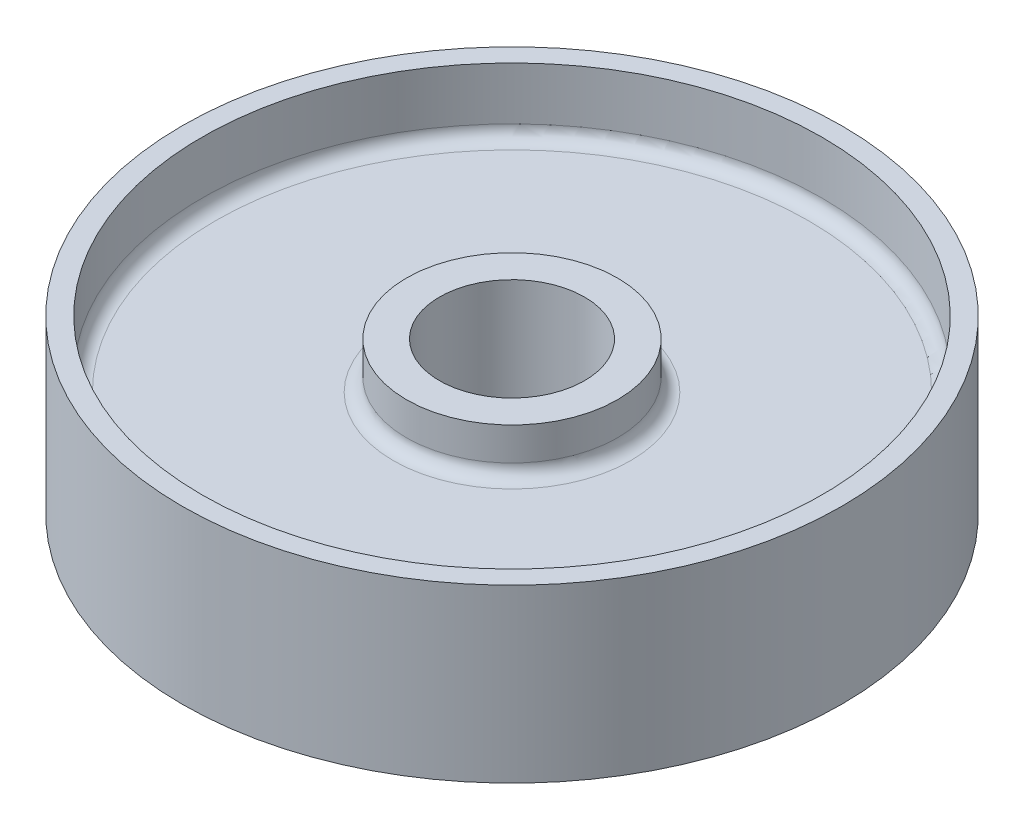
ISO-10303-21;
HEADER;
FILE_DESCRIPTION(('STEP AP214'),'2;1');
FILE_NAME('part.step','',(''),(''),'','','');
FILE_SCHEMA(('AUTOMOTIVE_DESIGN { 1 0 10303 214 1 1 1 1 }'));
ENDSEC;
DATA;
#1=APPLICATION_CONTEXT('core data for automotive mechanical design processes');
#2=APPLICATION_PROTOCOL_DEFINITION('international standard','automotive_design',2000,#1);
#3=PRODUCT_CONTEXT('',#1,'mechanical');
#4=PRODUCT('Part','Part','',(#3));
#5=PRODUCT_RELATED_PRODUCT_CATEGORY('part','',(#4));
#6=PRODUCT_DEFINITION_FORMATION('','',#4);
#7=PRODUCT_DEFINITION_CONTEXT('part definition',#1,'design');
#8=PRODUCT_DEFINITION('design','',#6,#7);
#9=PRODUCT_DEFINITION_SHAPE('','',#8);
#10=(LENGTH_UNIT() NAMED_UNIT(*) SI_UNIT(.MILLI.,.METRE.));
#11=(NAMED_UNIT(*) PLANE_ANGLE_UNIT() SI_UNIT($,.RADIAN.));
#12=(NAMED_UNIT(*) SI_UNIT($,.STERADIAN.) SOLID_ANGLE_UNIT());
#13=UNCERTAINTY_MEASURE_WITH_UNIT(LENGTH_MEASURE(1.E-05),#10,'distance_accuracy_value','');
#14=(GEOMETRIC_REPRESENTATION_CONTEXT(3) GLOBAL_UNCERTAINTY_ASSIGNED_CONTEXT((#13)) GLOBAL_UNIT_ASSIGNED_CONTEXT((#10,
#11,#12)) REPRESENTATION_CONTEXT('',''));
#15=CARTESIAN_POINT('',(0.,0.,0.));
#16=DIRECTION('',(0.,0.,1.));
#17=DIRECTION('',(1.,0.,0.));
#18=AXIS2_PLACEMENT_3D('',#15,#16,#17);
#19=CARTESIAN_POINT('',(0.,10.,-11.));
#20=DIRECTION('',(0.,1.,0.));
#21=DIRECTION('',(0.,0.,1.));
#22=AXIS2_PLACEMENT_3D('',#19,#20,#21);
#23=PLANE('',#22);
#24=CARTESIAN_POINT('',(0.,10.,0.));
#25=DIRECTION('',(0.,-1.,0.));
#26=DIRECTION('',(0.,0.,-1.));
#27=AXIS2_PLACEMENT_3D('',#24,#25,#26);
#28=CIRCLE('',#27,11.);
#29=CARTESIAN_POINT('',(0.,10.,-11.));
#30=VERTEX_POINT('',#29);
#31=EDGE_CURVE('E10',#30,#30,#28,.T.);
#32=ORIENTED_EDGE('',*,*,#31,.T.);
#33=EDGE_LOOP('',(#32));
#34=FACE_BOUND('',#33,.T.);
#35=CARTESIAN_POINT('',(0.,10.,0.));
#36=DIRECTION('',(0.,-1.,0.));
#37=DIRECTION('',(0.,0.,-1.));
#38=AXIS2_PLACEMENT_3D('',#35,#36,#37);
#39=CIRCLE('',#38,16.);
#40=CARTESIAN_POINT('',(0.,10.,-16.));
#41=VERTEX_POINT('',#40);
#42=EDGE_CURVE('E86',#41,#41,#39,.T.);
#43=ORIENTED_EDGE('',*,*,#42,.F.);
#44=EDGE_LOOP('',(#43));
#45=FACE_BOUND('',#44,.T.);
#46=ADVANCED_FACE('F34',(#34,#45),#23,.T.);
#47=CARTESIAN_POINT('',(0.,0.,0.));
#48=DIRECTION('',(0.,-1.,0.));
#49=DIRECTION('',(0.,0.,-1.));
#50=AXIS2_PLACEMENT_3D('',#47,#48,#49);
#51=CYLINDRICAL_SURFACE('',#50,11.);
#52=CARTESIAN_POINT('',(0.,-10.,0.));
#53=DIRECTION('',(0.,-1.,0.));
#54=DIRECTION('',(0.,0.,-1.));
#55=AXIS2_PLACEMENT_3D('',#52,#53,#54);
#56=CIRCLE('',#55,11.);
#57=CARTESIAN_POINT('',(0.,-10.,-11.));
#58=VERTEX_POINT('',#57);
#59=EDGE_CURVE('E40',#58,#58,#56,.T.);
#60=ORIENTED_EDGE('',*,*,#59,.T.);
#61=EDGE_LOOP('',(#60));
#62=FACE_BOUND('',#61,.T.);
#63=ORIENTED_EDGE('',*,*,#31,.F.);
#64=EDGE_LOOP('',(#63));
#65=FACE_BOUND('',#64,.T.);
#66=ADVANCED_FACE('F94',(#62,#65),#51,.F.);
#67=CARTESIAN_POINT('',(0.,-10.,-11.));
#68=DIRECTION('',(0.,-1.,0.));
#69=DIRECTION('',(0.,0.,-1.));
#70=AXIS2_PLACEMENT_3D('',#67,#68,#69);
#71=PLANE('',#70);
#72=CARTESIAN_POINT('',(0.,-10.,0.));
#73=DIRECTION('',(0.,-1.,0.));
#74=DIRECTION('',(0.,0.,-1.));
#75=AXIS2_PLACEMENT_3D('',#72,#73,#74);
#76=CIRCLE('',#75,16.);
#77=CARTESIAN_POINT('',(0.,-10.,-16.));
#78=VERTEX_POINT('',#77);
#79=EDGE_CURVE('E44',#78,#78,#76,.T.);
#80=ORIENTED_EDGE('',*,*,#79,.T.);
#81=EDGE_LOOP('',(#80));
#82=FACE_BOUND('',#81,.T.);
#83=ORIENTED_EDGE('',*,*,#59,.F.);
#84=EDGE_LOOP('',(#83));
#85=FACE_BOUND('',#84,.T.);
#86=ADVANCED_FACE('F98',(#82,#85),#71,.T.);
#87=CARTESIAN_POINT('',(0.,0.,0.));
#88=DIRECTION('',(0.,-1.,0.));
#89=DIRECTION('',(0.,0.,-1.));
#90=AXIS2_PLACEMENT_3D('',#87,#88,#89);
#91=CYLINDRICAL_SURFACE('',#90,16.);
#92=CARTESIAN_POINT('',(0.,-5.,0.));
#93=DIRECTION('',(0.,-1.,0.));
#94=DIRECTION('',(0.,0.,-1.));
#95=AXIS2_PLACEMENT_3D('',#92,#93,#94);
#96=CIRCLE('',#95,16.);
#97=CARTESIAN_POINT('',(0.,-5.,-16.));
#98=VERTEX_POINT('',#97);
#99=EDGE_CURVE('E48',#98,#98,#96,.T.);
#100=ORIENTED_EDGE('',*,*,#99,.T.);
#101=EDGE_LOOP('',(#100));
#102=FACE_BOUND('',#101,.T.);
#103=ORIENTED_EDGE('',*,*,#79,.F.);
#104=EDGE_LOOP('',(#103));
#105=FACE_BOUND('',#104,.T.);
#106=ADVANCED_FACE('F102',(#102,#105),#91,.T.);
#107=CARTESIAN_POINT('',(0.,-5.,0.));
#108=DIRECTION('',(0.,-1.,0.));
#109=DIRECTION('',(0.,0.,-1.));
#110=AXIS2_PLACEMENT_3D('',#107,#108,#109);
#111=TOROIDAL_SURFACE('',#110,18.,2.);
#112=CARTESIAN_POINT('',(0.,-3.,0.));
#113=DIRECTION('',(0.,-1.,0.));
#114=DIRECTION('',(0.,0.,-1.));
#115=AXIS2_PLACEMENT_3D('',#112,#113,#114);
#116=CIRCLE('',#115,18.);
#117=CARTESIAN_POINT('',(0.,-3.,-18.));
#118=VERTEX_POINT('',#117);
#119=EDGE_CURVE('E53',#118,#118,#116,.T.);
#120=ORIENTED_EDGE('',*,*,#119,.T.);
#121=EDGE_LOOP('',(#120));
#122=FACE_BOUND('',#121,.T.);
#123=ORIENTED_EDGE('',*,*,#99,.F.);
#124=EDGE_LOOP('',(#123));
#125=FACE_BOUND('',#124,.T.);
#126=ADVANCED_FACE('F109',(#122,#125),#111,.F.);
#127=CARTESIAN_POINT('',(0.,-3.,-18.));
#128=DIRECTION('',(0.,-1.,0.));
#129=DIRECTION('',(0.,0.,-1.));
#130=AXIS2_PLACEMENT_3D('',#127,#128,#129);
#131=PLANE('',#130);
#132=CARTESIAN_POINT('',(0.,-3.,0.));
#133=DIRECTION('',(0.,-1.,0.));
#134=DIRECTION('',(0.,0.,-1.));
#135=AXIS2_PLACEMENT_3D('',#132,#133,#134);
#136=CIRCLE('',#135,45.);
#137=CARTESIAN_POINT('',(0.,-3.,-45.));
#138=VERTEX_POINT('',#137);
#139=EDGE_CURVE('E56',#138,#138,#136,.T.);
#140=ORIENTED_EDGE('',*,*,#139,.T.);
#141=EDGE_LOOP('',(#140));
#142=FACE_BOUND('',#141,.T.);
#143=ORIENTED_EDGE('',*,*,#119,.F.);
#144=EDGE_LOOP('',(#143));
#145=FACE_BOUND('',#144,.T.);
#146=ADVANCED_FACE('F113',(#142,#145),#131,.T.);
#147=CARTESIAN_POINT('',(0.,-5.,0.));
#148=DIRECTION('',(0.,-1.,0.));
#149=DIRECTION('',(0.,0.,-1.));
#150=AXIS2_PLACEMENT_3D('',#147,#148,#149);
#151=TOROIDAL_SURFACE('',#150,45.,2.);
#152=CARTESIAN_POINT('',(0.,-5.,0.));
#153=DIRECTION('',(0.,-1.,0.));
#154=DIRECTION('',(0.,0.,-1.));
#155=AXIS2_PLACEMENT_3D('',#152,#153,#154);
#156=CIRCLE('',#155,47.);
#157=CARTESIAN_POINT('',(0.,-5.,-47.));
#158=VERTEX_POINT('',#157);
#159=EDGE_CURVE('E59',#158,#158,#156,.T.);
#160=ORIENTED_EDGE('',*,*,#159,.T.);
#161=EDGE_LOOP('',(#160));
#162=FACE_BOUND('',#161,.T.);
#163=ORIENTED_EDGE('',*,*,#139,.F.);
#164=EDGE_LOOP('',(#163));
#165=FACE_BOUND('',#164,.T.);
#166=ADVANCED_FACE('F117',(#162,#165),#151,.F.);
#167=CARTESIAN_POINT('',(0.,0.,0.));
#168=DIRECTION('',(0.,-1.,0.));
#169=DIRECTION('',(0.,0.,-1.));
#170=AXIS2_PLACEMENT_3D('',#167,#168,#169);
#171=CYLINDRICAL_SURFACE('',#170,47.);
#172=CARTESIAN_POINT('',(0.,-13.,0.));
#173=DIRECTION('',(0.,-1.,0.));
#174=DIRECTION('',(0.,0.,-1.));
#175=AXIS2_PLACEMENT_3D('',#172,#173,#174);
#176=CIRCLE('',#175,47.);
#177=CARTESIAN_POINT('',(0.,-13.,-47.));
#178=VERTEX_POINT('',#177);
#179=EDGE_CURVE('E62',#178,#178,#176,.T.);
#180=ORIENTED_EDGE('',*,*,#179,.T.);
#181=EDGE_LOOP('',(#180));
#182=FACE_BOUND('',#181,.T.);
#183=ORIENTED_EDGE('',*,*,#159,.F.);
#184=EDGE_LOOP('',(#183));
#185=FACE_BOUND('',#184,.T.);
#186=ADVANCED_FACE('F121',(#182,#185),#171,.F.);
#187=CARTESIAN_POINT('',(0.,-13.,-47.));
#188=DIRECTION('',(0.,-1.,0.));
#189=DIRECTION('',(0.,0.,-1.));
#190=AXIS2_PLACEMENT_3D('',#187,#188,#189);
#191=PLANE('',#190);
#192=CARTESIAN_POINT('',(0.,-13.,0.));
#193=DIRECTION('',(0.,-1.,0.));
#194=DIRECTION('',(0.,0.,-1.));
#195=AXIS2_PLACEMENT_3D('',#192,#193,#194);
#196=CIRCLE('',#195,50.);
#197=CARTESIAN_POINT('',(0.,-13.,-50.));
#198=VERTEX_POINT('',#197);
#199=EDGE_CURVE('E65',#198,#198,#196,.T.);
#200=ORIENTED_EDGE('',*,*,#199,.T.);
#201=EDGE_LOOP('',(#200));
#202=FACE_BOUND('',#201,.T.);
#203=ORIENTED_EDGE('',*,*,#179,.F.);
#204=EDGE_LOOP('',(#203));
#205=FACE_BOUND('',#204,.T.);
#206=ADVANCED_FACE('F125',(#202,#205),#191,.T.);
#207=CARTESIAN_POINT('',(0.,0.,0.));
#208=DIRECTION('',(0.,-1.,0.));
#209=DIRECTION('',(0.,0.,-1.));
#210=AXIS2_PLACEMENT_3D('',#207,#208,#209);
#211=CYLINDRICAL_SURFACE('',#210,50.);
#212=CARTESIAN_POINT('',(0.,13.,0.));
#213=DIRECTION('',(0.,-1.,0.));
#214=DIRECTION('',(0.,0.,-1.));
#215=AXIS2_PLACEMENT_3D('',#212,#213,#214);
#216=CIRCLE('',#215,50.);
#217=CARTESIAN_POINT('',(0.,13.,-50.));
#218=VERTEX_POINT('',#217);
#219=EDGE_CURVE('E68',#218,#218,#216,.T.);
#220=ORIENTED_EDGE('',*,*,#219,.T.);
#221=EDGE_LOOP('',(#220));
#222=FACE_BOUND('',#221,.T.);
#223=ORIENTED_EDGE('',*,*,#199,.F.);
#224=EDGE_LOOP('',(#223));
#225=FACE_BOUND('',#224,.T.);
#226=ADVANCED_FACE('F129',(#222,#225),#211,.T.);
#227=CARTESIAN_POINT('',(0.,13.,-47.));
#228=DIRECTION('',(0.,1.,0.));
#229=DIRECTION('',(0.,0.,1.));
#230=AXIS2_PLACEMENT_3D('',#227,#228,#229);
#231=PLANE('',#230);
#232=CARTESIAN_POINT('',(0.,13.,0.));
#233=DIRECTION('',(0.,-1.,0.));
#234=DIRECTION('',(0.,0.,-1.));
#235=AXIS2_PLACEMENT_3D('',#232,#233,#234);
#236=CIRCLE('',#235,47.);
#237=CARTESIAN_POINT('',(0.,13.,-47.));
#238=VERTEX_POINT('',#237);
#239=EDGE_CURVE('E71',#238,#238,#236,.T.);
#240=ORIENTED_EDGE('',*,*,#239,.T.);
#241=EDGE_LOOP('',(#240));
#242=FACE_BOUND('',#241,.T.);
#243=ORIENTED_EDGE('',*,*,#219,.F.);
#244=EDGE_LOOP('',(#243));
#245=FACE_BOUND('',#244,.T.);
#246=ADVANCED_FACE('F133',(#242,#245),#231,.T.);
#247=CARTESIAN_POINT('',(0.,0.,0.));
#248=DIRECTION('',(0.,-1.,0.));
#249=DIRECTION('',(0.,0.,-1.));
#250=AXIS2_PLACEMENT_3D('',#247,#248,#249);
#251=CYLINDRICAL_SURFACE('',#250,47.);
#252=CARTESIAN_POINT('',(0.,5.,0.));
#253=DIRECTION('',(0.,-1.,0.));
#254=DIRECTION('',(0.,0.,-1.));
#255=AXIS2_PLACEMENT_3D('',#252,#253,#254);
#256=CIRCLE('',#255,47.);
#257=CARTESIAN_POINT('',(0.,5.,-47.));
#258=VERTEX_POINT('',#257);
#259=EDGE_CURVE('E74',#258,#258,#256,.T.);
#260=ORIENTED_EDGE('',*,*,#259,.T.);
#261=EDGE_LOOP('',(#260));
#262=FACE_BOUND('',#261,.T.);
#263=ORIENTED_EDGE('',*,*,#239,.F.);
#264=EDGE_LOOP('',(#263));
#265=FACE_BOUND('',#264,.T.);
#266=ADVANCED_FACE('F137',(#262,#265),#251,.F.);
#267=CARTESIAN_POINT('',(0.,5.,0.));
#268=DIRECTION('',(0.,-1.,0.));
#269=DIRECTION('',(0.,0.,-1.));
#270=AXIS2_PLACEMENT_3D('',#267,#268,#269);
#271=TOROIDAL_SURFACE('',#270,45.,2.);
#272=CARTESIAN_POINT('',(0.,3.,0.));
#273=DIRECTION('',(0.,-1.,0.));
#274=DIRECTION('',(0.,0.,-1.));
#275=AXIS2_PLACEMENT_3D('',#272,#273,#274);
#276=CIRCLE('',#275,45.);
#277=CARTESIAN_POINT('',(0.,3.,-45.));
#278=VERTEX_POINT('',#277);
#279=EDGE_CURVE('E77',#278,#278,#276,.T.);
#280=ORIENTED_EDGE('',*,*,#279,.T.);
#281=EDGE_LOOP('',(#280));
#282=FACE_BOUND('',#281,.T.);
#283=ORIENTED_EDGE('',*,*,#259,.F.);
#284=EDGE_LOOP('',(#283));
#285=FACE_BOUND('',#284,.T.);
#286=ADVANCED_FACE('F141',(#282,#285),#271,.F.);
#287=CARTESIAN_POINT('',(0.,3.,-18.));
#288=DIRECTION('',(0.,1.,0.));
#289=DIRECTION('',(0.,0.,1.));
#290=AXIS2_PLACEMENT_3D('',#287,#288,#289);
#291=PLANE('',#290);
#292=CARTESIAN_POINT('',(0.,3.,0.));
#293=DIRECTION('',(0.,-1.,0.));
#294=DIRECTION('',(0.,0.,-1.));
#295=AXIS2_PLACEMENT_3D('',#292,#293,#294);
#296=CIRCLE('',#295,18.);
#297=CARTESIAN_POINT('',(0.,3.,-18.));
#298=VERTEX_POINT('',#297);
#299=EDGE_CURVE('E80',#298,#298,#296,.T.);
#300=ORIENTED_EDGE('',*,*,#299,.T.);
#301=EDGE_LOOP('',(#300));
#302=FACE_BOUND('',#301,.T.);
#303=ORIENTED_EDGE('',*,*,#279,.F.);
#304=EDGE_LOOP('',(#303));
#305=FACE_BOUND('',#304,.T.);
#306=ADVANCED_FACE('F145',(#302,#305),#291,.T.);
#307=CARTESIAN_POINT('',(0.,5.,0.));
#308=DIRECTION('',(0.,-1.,0.));
#309=DIRECTION('',(0.,0.,-1.));
#310=AXIS2_PLACEMENT_3D('',#307,#308,#309);
#311=TOROIDAL_SURFACE('',#310,18.,2.);
#312=CARTESIAN_POINT('',(0.,5.,0.));
#313=DIRECTION('',(0.,-1.,0.));
#314=DIRECTION('',(0.,0.,-1.));
#315=AXIS2_PLACEMENT_3D('',#312,#313,#314);
#316=CIRCLE('',#315,16.);
#317=CARTESIAN_POINT('',(0.,5.,-16.));
#318=VERTEX_POINT('',#317);
#319=EDGE_CURVE('E83',#318,#318,#316,.T.);
#320=ORIENTED_EDGE('',*,*,#319,.T.);
#321=EDGE_LOOP('',(#320));
#322=FACE_BOUND('',#321,.T.);
#323=ORIENTED_EDGE('',*,*,#299,.F.);
#324=EDGE_LOOP('',(#323));
#325=FACE_BOUND('',#324,.T.);
#326=ADVANCED_FACE('F149',(#322,#325),#311,.F.);
#327=CARTESIAN_POINT('',(0.,0.,0.));
#328=DIRECTION('',(0.,-1.,0.));
#329=DIRECTION('',(0.,0.,-1.));
#330=AXIS2_PLACEMENT_3D('',#327,#328,#329);
#331=CYLINDRICAL_SURFACE('',#330,16.);
#332=ORIENTED_EDGE('',*,*,#42,.T.);
#333=EDGE_LOOP('',(#332));
#334=FACE_BOUND('',#333,.T.);
#335=ORIENTED_EDGE('',*,*,#319,.F.);
#336=EDGE_LOOP('',(#335));
#337=FACE_BOUND('',#336,.T.);
#338=ADVANCED_FACE('F90',(#334,#337),#331,.T.);
#339=CLOSED_SHELL('',(#46,#66,#86,#106,#126,#146,#166,#186,#206,#226,#246,#266,#286,#306,#326,#338));
#340=MANIFOLD_SOLID_BREP('B2',#339);
#341=ADVANCED_BREP_SHAPE_REPRESENTATION('',(#18,#340),#14);
#342=SHAPE_DEFINITION_REPRESENTATION(#9,#341);
ENDSEC;
END-ISO-10303-21;
